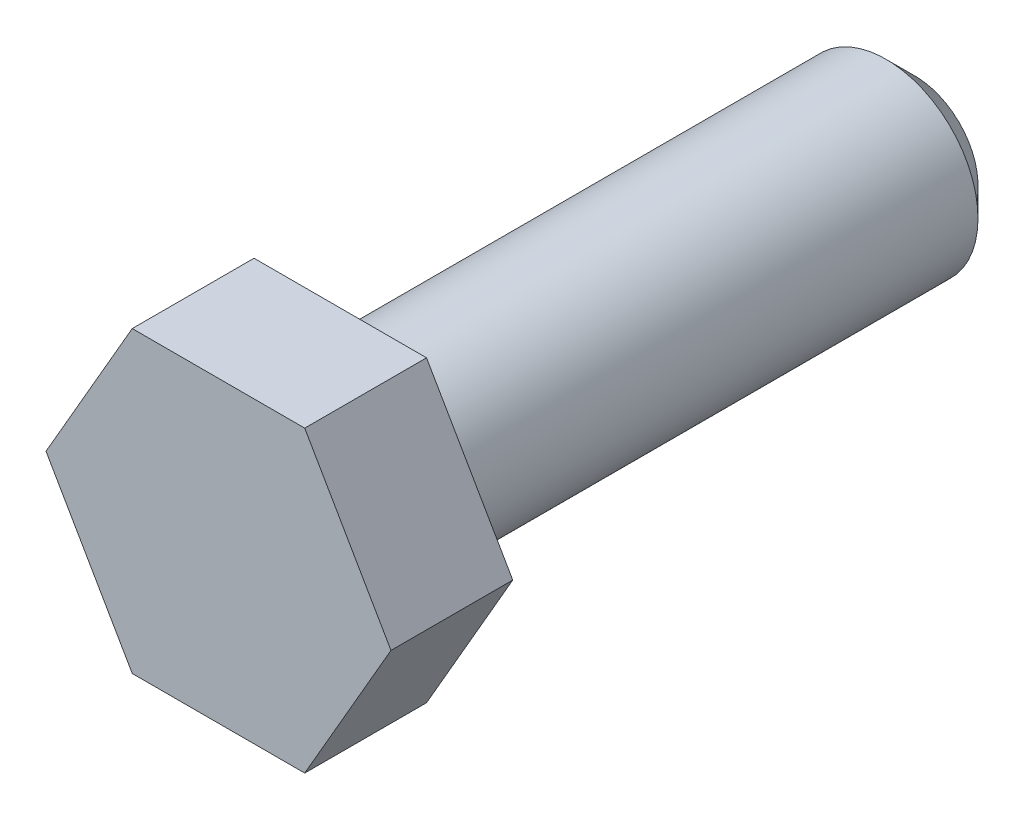
ISO-10303-21;
HEADER;
FILE_DESCRIPTION(('STEP AP214'),'2;1');
FILE_NAME('part.step','',(''),(''),'','','');
FILE_SCHEMA(('AUTOMOTIVE_DESIGN { 1 0 10303 214 1 1 1 1 }'));
ENDSEC;
DATA;
#1=APPLICATION_CONTEXT('core data for automotive mechanical design processes');
#2=APPLICATION_PROTOCOL_DEFINITION('international standard','automotive_design',2000,#1);
#3=PRODUCT_CONTEXT('',#1,'mechanical');
#4=PRODUCT('Part','Part','',(#3));
#5=PRODUCT_RELATED_PRODUCT_CATEGORY('part','',(#4));
#6=PRODUCT_DEFINITION_FORMATION('','',#4);
#7=PRODUCT_DEFINITION_CONTEXT('part definition',#1,'design');
#8=PRODUCT_DEFINITION('design','',#6,#7);
#9=PRODUCT_DEFINITION_SHAPE('','',#8);
#10=(LENGTH_UNIT() NAMED_UNIT(*) SI_UNIT(.MILLI.,.METRE.));
#11=(NAMED_UNIT(*) PLANE_ANGLE_UNIT() SI_UNIT($,.RADIAN.));
#12=(NAMED_UNIT(*) SI_UNIT($,.STERADIAN.) SOLID_ANGLE_UNIT());
#13=UNCERTAINTY_MEASURE_WITH_UNIT(LENGTH_MEASURE(1.E-05),#10,'distance_accuracy_value','');
#14=(GEOMETRIC_REPRESENTATION_CONTEXT(3) GLOBAL_UNCERTAINTY_ASSIGNED_CONTEXT((#13)) GLOBAL_UNIT_ASSIGNED_CONTEXT((#10,
#11,#12)) REPRESENTATION_CONTEXT('',''));
#15=CARTESIAN_POINT('',(0.,0.,0.));
#16=DIRECTION('',(0.,0.,1.));
#17=DIRECTION('',(1.,0.,0.));
#18=AXIS2_PLACEMENT_3D('',#15,#16,#17);
#19=CARTESIAN_POINT('',(-11.2583302491977,-6.5,0.));
#20=DIRECTION('',(0.,0.,1.));
#21=DIRECTION('',(1.,0.,0.));
#22=AXIS2_PLACEMENT_3D('',#19,#20,#21);
#23=PLANE('',#22);
#24=DIRECTION('',(-0.499999999999999,-0.866025403784439,0.));
#25=VECTOR('',#24,1.);
#26=CARTESIAN_POINT('',(-3.75277674973257,6.5,0.));
#27=LINE('',#26,#25);
#28=CARTESIAN_POINT('',(-3.75277674973257,6.5,0.));
#29=VERTEX_POINT('',#28);
#30=CARTESIAN_POINT('',(-7.50555349946513,0.,0.));
#31=VERTEX_POINT('',#30);
#32=EDGE_CURVE('E117',#29,#31,#27,.T.);
#33=ORIENTED_EDGE('',*,*,#32,.F.);
#34=DIRECTION('',(1.,0.,0.));
#35=VECTOR('',#34,1.);
#36=CARTESIAN_POINT('',(-3.75277674973257,6.5,0.));
#37=LINE('',#36,#35);
#38=CARTESIAN_POINT('',(3.75277674973256,6.5,0.));
#39=VERTEX_POINT('',#38);
#40=EDGE_CURVE('E127',#29,#39,#37,.T.);
#41=ORIENTED_EDGE('',*,*,#40,.T.);
#42=DIRECTION('',(0.5,-0.866025403784438,0.));
#43=VECTOR('',#42,1.);
#44=CARTESIAN_POINT('',(3.75277674973256,6.5,0.));
#45=LINE('',#44,#43);
#46=CARTESIAN_POINT('',(7.50555349946513,0.,0.));
#47=VERTEX_POINT('',#46);
#48=EDGE_CURVE('E125',#39,#47,#45,.T.);
#49=ORIENTED_EDGE('',*,*,#48,.T.);
#50=DIRECTION('',(-0.5,-0.866025403784439,0.));
#51=VECTOR('',#50,1.);
#52=CARTESIAN_POINT('',(7.50555349946513,0.,0.));
#53=LINE('',#52,#51);
#54=CARTESIAN_POINT('',(3.75277674973257,-6.5,0.));
#55=VERTEX_POINT('',#54);
#56=EDGE_CURVE('E96',#47,#55,#53,.T.);
#57=ORIENTED_EDGE('',*,*,#56,.T.);
#58=DIRECTION('',(1.,0.,0.));
#59=VECTOR('',#58,1.);
#60=CARTESIAN_POINT('',(-3.75277674973257,-6.5,0.));
#61=LINE('',#60,#59);
#62=CARTESIAN_POINT('',(-3.75277674973257,-6.5,0.));
#63=VERTEX_POINT('',#62);
#64=EDGE_CURVE('E121',#63,#55,#61,.T.);
#65=ORIENTED_EDGE('',*,*,#64,.F.);
#66=DIRECTION('',(0.5,-0.866025403784439,0.));
#67=VECTOR('',#66,1.);
#68=CARTESIAN_POINT('',(-7.50555349946513,0.,0.));
#69=LINE('',#68,#67);
#70=EDGE_CURVE('E119',#31,#63,#69,.T.);
#71=ORIENTED_EDGE('',*,*,#70,.F.);
#72=EDGE_LOOP('',(#33,#41,#49,#57,#65,#71));
#73=FACE_BOUND('',#72,.T.);
#74=CARTESIAN_POINT('',(0.,0.,0.));
#75=DIRECTION('',(0.,0.,1.));
#76=DIRECTION('',(1.,0.,0.));
#77=AXIS2_PLACEMENT_3D('',#74,#75,#76);
#78=CIRCLE('',#77,4.);
#79=CARTESIAN_POINT('',(4.,0.,0.));
#80=VERTEX_POINT('',#79);
#81=EDGE_CURVE('E139',#80,#80,#78,.F.);
#82=ORIENTED_EDGE('',*,*,#81,.F.);
#83=EDGE_LOOP('',(#82));
#84=FACE_BOUND('',#83,.T.);
#85=ADVANCED_FACE('F31',(#73,#84),#23,.F.);
#86=CARTESIAN_POINT('',(-3.75277674973257,6.5,5.3));
#87=DIRECTION('',(0.866025403784439,-0.499999999999999,0.));
#88=DIRECTION('',(0.499999999999999,0.866025403784439,0.));
#89=AXIS2_PLACEMENT_3D('',#86,#87,#88);
#90=PLANE('',#89);
#91=ORIENTED_EDGE('',*,*,#32,.T.);
#92=DIRECTION('',(0.,0.,-1.));
#93=VECTOR('',#92,1.);
#94=CARTESIAN_POINT('',(-7.50555349946513,0.,5.3));
#95=LINE('',#94,#93);
#96=CARTESIAN_POINT('',(-7.50555349946513,0.,5.3));
#97=VERTEX_POINT('',#96);
#98=EDGE_CURVE('E137',#97,#31,#95,.T.);
#99=ORIENTED_EDGE('',*,*,#98,.F.);
#100=DIRECTION('',(-0.499999999999999,-0.866025403784439,0.));
#101=VECTOR('',#100,1.);
#102=CARTESIAN_POINT('',(-3.75277674973257,6.5,5.3));
#103=LINE('',#102,#101);
#104=CARTESIAN_POINT('',(-3.75277674973257,6.5,5.3));
#105=VERTEX_POINT('',#104);
#106=EDGE_CURVE('E130',#105,#97,#103,.T.);
#107=ORIENTED_EDGE('',*,*,#106,.F.);
#108=DIRECTION('',(0.,0.,-1.));
#109=VECTOR('',#108,1.);
#110=CARTESIAN_POINT('',(-3.75277674973257,6.5,5.3));
#111=LINE('',#110,#109);
#112=EDGE_CURVE('E48',#105,#29,#111,.T.);
#113=ORIENTED_EDGE('',*,*,#112,.T.);
#114=EDGE_LOOP('',(#91,#99,#107,#113));
#115=FACE_BOUND('',#114,.T.);
#116=ADVANCED_FACE('F155',(#115),#90,.F.);
#117=CARTESIAN_POINT('',(-7.50555349946513,0.,5.3));
#118=DIRECTION('',(0.866025403784439,0.5,0.));
#119=DIRECTION('',(-0.5,0.866025403784439,0.));
#120=AXIS2_PLACEMENT_3D('',#117,#118,#119);
#121=PLANE('',#120);
#122=ORIENTED_EDGE('',*,*,#70,.T.);
#123=DIRECTION('',(0.,0.,-1.));
#124=VECTOR('',#123,1.);
#125=CARTESIAN_POINT('',(-3.75277674973257,-6.5,5.3));
#126=LINE('',#125,#124);
#127=CARTESIAN_POINT('',(-3.75277674973257,-6.5,5.3));
#128=VERTEX_POINT('',#127);
#129=EDGE_CURVE('E134',#128,#63,#126,.T.);
#130=ORIENTED_EDGE('',*,*,#129,.F.);
#131=DIRECTION('',(0.5,-0.866025403784439,0.));
#132=VECTOR('',#131,1.);
#133=CARTESIAN_POINT('',(-7.50555349946513,0.,5.3));
#134=LINE('',#133,#132);
#135=EDGE_CURVE('E81',#97,#128,#134,.T.);
#136=ORIENTED_EDGE('',*,*,#135,.F.);
#137=ORIENTED_EDGE('',*,*,#98,.T.);
#138=EDGE_LOOP('',(#122,#130,#136,#137));
#139=FACE_BOUND('',#138,.T.);
#140=ADVANCED_FACE('F161',(#139),#121,.F.);
#141=CARTESIAN_POINT('',(-3.75277674973257,-6.5,5.3));
#142=DIRECTION('',(0.,1.,0.));
#143=DIRECTION('',(0.,0.,1.));
#144=AXIS2_PLACEMENT_3D('',#141,#142,#143);
#145=PLANE('',#144);
#146=ORIENTED_EDGE('',*,*,#64,.T.);
#147=DIRECTION('',(0.,0.,-1.));
#148=VECTOR('',#147,1.);
#149=CARTESIAN_POINT('',(3.75277674973257,-6.5,5.3));
#150=LINE('',#149,#148);
#151=CARTESIAN_POINT('',(3.75277674973257,-6.5,5.3));
#152=VERTEX_POINT('',#151);
#153=EDGE_CURVE('E100',#152,#55,#150,.T.);
#154=ORIENTED_EDGE('',*,*,#153,.F.);
#155=DIRECTION('',(1.,0.,0.));
#156=VECTOR('',#155,1.);
#157=CARTESIAN_POINT('',(-3.75277674973257,-6.5,5.3));
#158=LINE('',#157,#156);
#159=EDGE_CURVE('E108',#128,#152,#158,.T.);
#160=ORIENTED_EDGE('',*,*,#159,.F.);
#161=ORIENTED_EDGE('',*,*,#129,.T.);
#162=EDGE_LOOP('',(#146,#154,#160,#161));
#163=FACE_BOUND('',#162,.T.);
#164=ADVANCED_FACE('F173',(#163),#145,.F.);
#165=CARTESIAN_POINT('',(7.50555349946513,0.,5.3));
#166=DIRECTION('',(0.866025403784439,-0.5,0.));
#167=DIRECTION('',(0.5,0.866025403784439,0.));
#168=AXIS2_PLACEMENT_3D('',#165,#166,#167);
#169=PLANE('',#168);
#170=ORIENTED_EDGE('',*,*,#56,.F.);
#171=DIRECTION('',(0.,0.,-1.));
#172=VECTOR('',#171,1.);
#173=CARTESIAN_POINT('',(7.50555349946513,0.,5.3));
#174=LINE('',#173,#172);
#175=CARTESIAN_POINT('',(7.50555349946513,0.,5.3));
#176=VERTEX_POINT('',#175);
#177=EDGE_CURVE('E91',#176,#47,#174,.T.);
#178=ORIENTED_EDGE('',*,*,#177,.F.);
#179=DIRECTION('',(-0.5,-0.866025403784439,0.));
#180=VECTOR('',#179,1.);
#181=CARTESIAN_POINT('',(7.50555349946513,0.,5.3));
#182=LINE('',#181,#180);
#183=EDGE_CURVE('E94',#176,#152,#182,.T.);
#184=ORIENTED_EDGE('',*,*,#183,.T.);
#185=ORIENTED_EDGE('',*,*,#153,.T.);
#186=EDGE_LOOP('',(#170,#178,#184,#185));
#187=FACE_BOUND('',#186,.T.);
#188=ADVANCED_FACE('F93',(#187),#169,.T.);
#189=CARTESIAN_POINT('',(3.75277674973256,6.5,5.3));
#190=DIRECTION('',(0.866025403784438,0.5,0.));
#191=DIRECTION('',(-0.5,0.866025403784438,0.));
#192=AXIS2_PLACEMENT_3D('',#189,#190,#191);
#193=PLANE('',#192);
#194=ORIENTED_EDGE('',*,*,#48,.F.);
#195=DIRECTION('',(0.,0.,-1.));
#196=VECTOR('',#195,1.);
#197=CARTESIAN_POINT('',(3.75277674973256,6.5,5.3));
#198=LINE('',#197,#196);
#199=CARTESIAN_POINT('',(3.75277674973256,6.5,5.3));
#200=VERTEX_POINT('',#199);
#201=EDGE_CURVE('E68',#200,#39,#198,.T.);
#202=ORIENTED_EDGE('',*,*,#201,.F.);
#203=DIRECTION('',(0.5,-0.866025403784438,0.));
#204=VECTOR('',#203,1.);
#205=CARTESIAN_POINT('',(3.75277674973256,6.5,5.3));
#206=LINE('',#205,#204);
#207=EDGE_CURVE('E106',#200,#176,#206,.T.);
#208=ORIENTED_EDGE('',*,*,#207,.T.);
#209=ORIENTED_EDGE('',*,*,#177,.T.);
#210=EDGE_LOOP('',(#194,#202,#208,#209));
#211=FACE_BOUND('',#210,.T.);
#212=ADVANCED_FACE('F111',(#211),#193,.T.);
#213=CARTESIAN_POINT('',(-3.75277674973257,6.5,5.3));
#214=DIRECTION('',(0.,1.,0.));
#215=DIRECTION('',(0.,0.,1.));
#216=AXIS2_PLACEMENT_3D('',#213,#214,#215);
#217=PLANE('',#216);
#218=ORIENTED_EDGE('',*,*,#40,.F.);
#219=ORIENTED_EDGE('',*,*,#112,.F.);
#220=DIRECTION('',(1.,0.,0.));
#221=VECTOR('',#220,1.);
#222=CARTESIAN_POINT('',(-3.75277674973257,6.5,5.3));
#223=LINE('',#222,#221);
#224=EDGE_CURVE('E112',#105,#200,#223,.T.);
#225=ORIENTED_EDGE('',*,*,#224,.T.);
#226=ORIENTED_EDGE('',*,*,#201,.T.);
#227=EDGE_LOOP('',(#218,#219,#225,#226));
#228=FACE_BOUND('',#227,.T.);
#229=ADVANCED_FACE('F166',(#228),#217,.T.);
#230=CARTESIAN_POINT('',(-11.2583302491977,-6.5,5.3));
#231=DIRECTION('',(0.,0.,1.));
#232=DIRECTION('',(1.,0.,0.));
#233=AXIS2_PLACEMENT_3D('',#230,#231,#232);
#234=PLANE('',#233);
#235=ORIENTED_EDGE('',*,*,#106,.T.);
#236=ORIENTED_EDGE('',*,*,#135,.T.);
#237=ORIENTED_EDGE('',*,*,#159,.T.);
#238=ORIENTED_EDGE('',*,*,#183,.F.);
#239=ORIENTED_EDGE('',*,*,#207,.F.);
#240=ORIENTED_EDGE('',*,*,#224,.F.);
#241=EDGE_LOOP('',(#235,#236,#237,#238,#239,#240));
#242=FACE_BOUND('',#241,.T.);
#243=ADVANCED_FACE('F104',(#242),#234,.T.);
#244=CARTESIAN_POINT('',(0.,0.,-25.));
#245=DIRECTION('',(0.,0.,1.));
#246=DIRECTION('',(1.,0.,0.));
#247=AXIS2_PLACEMENT_3D('',#244,#245,#246);
#248=CYLINDRICAL_SURFACE('',#247,4.);
#249=CARTESIAN_POINT('',(0.,0.,-23.75));
#250=DIRECTION('',(0.,0.,-1.));
#251=DIRECTION('',(-1.,0.,0.));
#252=AXIS2_PLACEMENT_3D('',#249,#250,#251);
#253=CIRCLE('',#252,4.);
#254=CARTESIAN_POINT('',(-4.,0.,-23.75));
#255=VERTEX_POINT('',#254);
#256=EDGE_CURVE('E11',#255,#255,#253,.F.);
#257=ORIENTED_EDGE('',*,*,#256,.T.);
#258=EDGE_LOOP('',(#257));
#259=FACE_BOUND('',#258,.T.);
#260=ORIENTED_EDGE('',*,*,#81,.T.);
#261=EDGE_LOOP('',(#260));
#262=FACE_BOUND('',#261,.T.);
#263=ADVANCED_FACE('F151',(#259,#262),#248,.T.);
#264=CARTESIAN_POINT('',(0.,0.,-25.));
#265=DIRECTION('',(0.,0.,-1.));
#266=DIRECTION('',(-1.,0.,0.));
#267=AXIS2_PLACEMENT_3D('',#264,#265,#266);
#268=PLANE('',#267);
#269=CARTESIAN_POINT('',(0.,0.,-25.));
#270=DIRECTION('',(0.,0.,-1.));
#271=DIRECTION('',(-1.,0.,0.));
#272=AXIS2_PLACEMENT_3D('',#269,#270,#271);
#273=CIRCLE('',#272,2.74999999999998);
#274=CARTESIAN_POINT('',(-2.74999999999998,0.,-25.));
#275=VERTEX_POINT('',#274);
#276=EDGE_CURVE('E40',#275,#275,#273,.T.);
#277=ORIENTED_EDGE('',*,*,#276,.T.);
#278=EDGE_LOOP('',(#277));
#279=FACE_BOUND('',#278,.T.);
#280=ADVANCED_FACE('F144',(#279),#268,.T.);
#281=CARTESIAN_POINT('',(0.,0.,-25.));
#282=DIRECTION('',(0.,0.,1.));
#283=DIRECTION('',(1.,0.,0.));
#284=AXIS2_PLACEMENT_3D('',#281,#282,#283);
#285=CONICAL_SURFACE('',#284,2.74999999999998,0.785398163397454);
#286=ORIENTED_EDGE('',*,*,#256,.F.);
#287=EDGE_LOOP('',(#286));
#288=FACE_BOUND('',#287,.T.);
#289=ORIENTED_EDGE('',*,*,#276,.F.);
#290=EDGE_LOOP('',(#289));
#291=FACE_BOUND('',#290,.T.);
#292=ADVANCED_FACE('F33',(#288,#291),#285,.T.);
#293=CLOSED_SHELL('',(#85,#116,#140,#164,#188,#212,#229,#243,#263,#280,#292));
#294=MANIFOLD_SOLID_BREP('B2',#293);
#295=ADVANCED_BREP_SHAPE_REPRESENTATION('',(#18,#294),#14);
#296=SHAPE_DEFINITION_REPRESENTATION(#9,#295);
ENDSEC;
END-ISO-10303-21;
